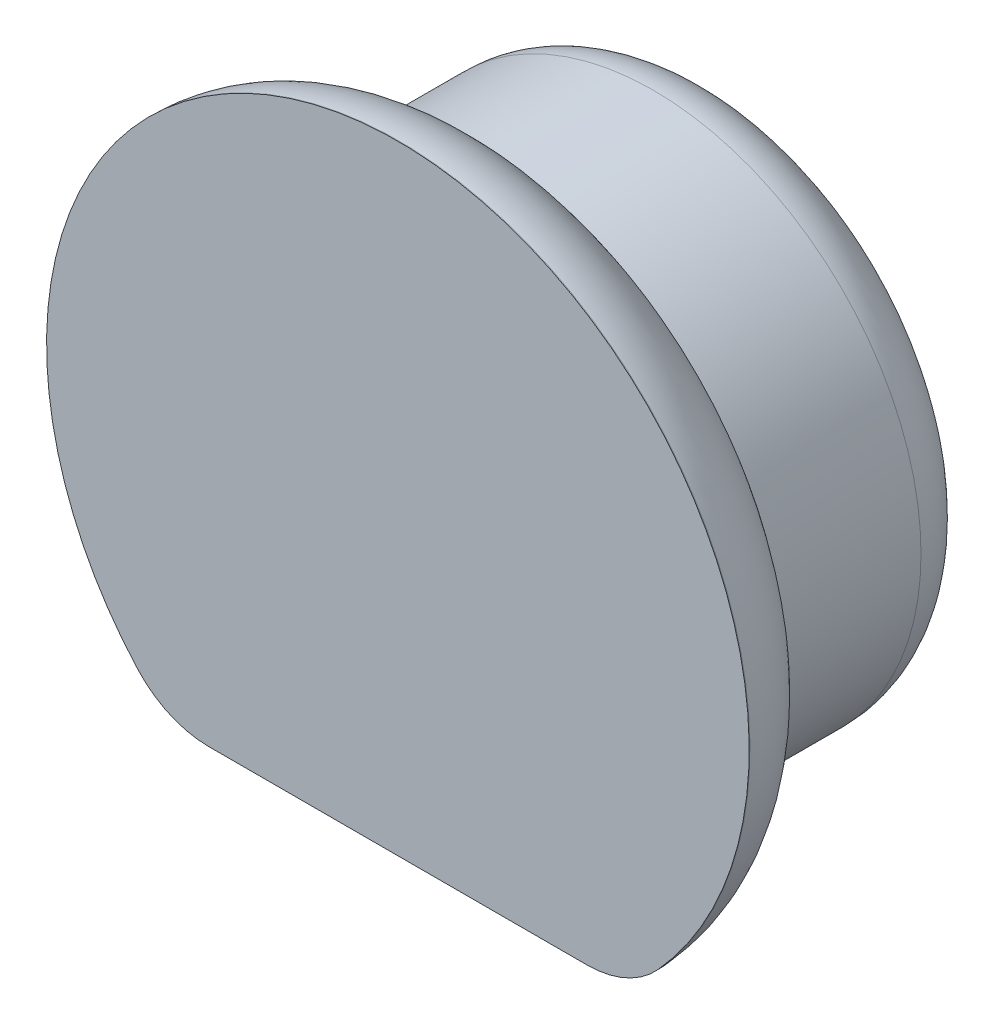
ISO-10303-21;
HEADER;
FILE_DESCRIPTION(('STEP AP214'),'2;1');
FILE_NAME('part.step','',(''),(''),'','','');
FILE_SCHEMA(('AUTOMOTIVE_DESIGN { 1 0 10303 214 1 1 1 1 }'));
ENDSEC;
DATA;
#1=APPLICATION_CONTEXT('core data for automotive mechanical design processes');
#2=APPLICATION_PROTOCOL_DEFINITION('international standard','automotive_design',2000,#1);
#3=PRODUCT_CONTEXT('',#1,'mechanical');
#4=PRODUCT('Part','Part','',(#3));
#5=PRODUCT_RELATED_PRODUCT_CATEGORY('part','',(#4));
#6=PRODUCT_DEFINITION_FORMATION('','',#4);
#7=PRODUCT_DEFINITION_CONTEXT('part definition',#1,'design');
#8=PRODUCT_DEFINITION('design','',#6,#7);
#9=PRODUCT_DEFINITION_SHAPE('','',#8);
#10=(LENGTH_UNIT() NAMED_UNIT(*) SI_UNIT(.MILLI.,.METRE.));
#11=(NAMED_UNIT(*) PLANE_ANGLE_UNIT() SI_UNIT($,.RADIAN.));
#12=(NAMED_UNIT(*) SI_UNIT($,.STERADIAN.) SOLID_ANGLE_UNIT());
#13=UNCERTAINTY_MEASURE_WITH_UNIT(LENGTH_MEASURE(1.E-05),#10,'distance_accuracy_value','');
#14=(GEOMETRIC_REPRESENTATION_CONTEXT(3) GLOBAL_UNCERTAINTY_ASSIGNED_CONTEXT((#13)) GLOBAL_UNIT_ASSIGNED_CONTEXT((#10,
#11,#12)) REPRESENTATION_CONTEXT('',''));
#15=CARTESIAN_POINT('',(0.,0.,0.));
#16=DIRECTION('',(0.,0.,1.));
#17=DIRECTION('',(1.,0.,0.));
#18=AXIS2_PLACEMENT_3D('',#15,#16,#17);
#19=CARTESIAN_POINT('',(0.,0.,5.));
#20=DIRECTION('',(0.,0.,-1.));
#21=DIRECTION('',(-1.,0.,0.));
#22=AXIS2_PLACEMENT_3D('',#19,#20,#21);
#23=CYLINDRICAL_SURFACE('',#22,5.5);
#24=CARTESIAN_POINT('',(0.,0.,4.98791800849375));
#25=DIRECTION('',(0.,0.,-1.));
#26=DIRECTION('',(-1.,0.,0.));
#27=AXIS2_PLACEMENT_3D('',#24,#25,#26);
#28=CIRCLE('',#27,5.5);
#29=CARTESIAN_POINT('',(4.07053417102719,-3.69875,4.98791800849375));
#30=VERTEX_POINT('',#29);
#31=CARTESIAN_POINT('',(-4.07053417102719,-3.69875,4.98791800849375));
#32=VERTEX_POINT('',#31);
#33=EDGE_CURVE('E218',#30,#32,#28,.F.);
#34=ORIENTED_EDGE('',*,*,#33,.T.);
#35=DIRECTION('',(0.,0.,-1.));
#36=VECTOR('',#35,1.);
#37=CARTESIAN_POINT('',(-4.07053417102719,-3.69875,5.));
#38=LINE('',#37,#36);
#39=CARTESIAN_POINT('',(-4.07053417102719,-3.69875,5.));
#40=VERTEX_POINT('',#39);
#41=EDGE_CURVE('E222',#32,#40,#38,.F.);
#42=ORIENTED_EDGE('',*,*,#41,.T.);
#43=CARTESIAN_POINT('',(0.,0.,5.));
#44=DIRECTION('',(0.,0.,1.));
#45=DIRECTION('',(1.,0.,0.));
#46=AXIS2_PLACEMENT_3D('',#43,#44,#45);
#47=CIRCLE('',#46,5.5);
#48=CARTESIAN_POINT('',(4.07053417102719,-3.69875,5.));
#49=VERTEX_POINT('',#48);
#50=EDGE_CURVE('E114',#49,#40,#47,.T.);
#51=ORIENTED_EDGE('',*,*,#50,.F.);
#52=DIRECTION('',(0.,0.,-1.));
#53=VECTOR('',#52,1.);
#54=CARTESIAN_POINT('',(4.07053417102719,-3.69875,5.));
#55=LINE('',#54,#53);
#56=EDGE_CURVE('E220',#49,#30,#55,.T.);
#57=ORIENTED_EDGE('',*,*,#56,.T.);
#58=EDGE_LOOP('',(#34,#42,#51,#57));
#59=FACE_BOUND('',#58,.T.);
#60=ADVANCED_FACE('F35',(#59),#23,.T.);
#61=CARTESIAN_POINT('',(0.,0.,5.));
#62=DIRECTION('',(0.,0.,1.));
#63=DIRECTION('',(1.,0.,0.));
#64=AXIS2_PLACEMENT_3D('',#61,#62,#63);
#65=PLANE('',#64);
#66=ORIENTED_EDGE('',*,*,#50,.T.);
#67=CARTESIAN_POINT('',(-2.96038848801977,-2.69,5.));
#68=DIRECTION('',(0.,0.,1.));
#69=DIRECTION('',(1.,0.,0.));
#70=AXIS2_PLACEMENT_3D('',#67,#68,#69);
#71=CIRCLE('',#70,1.5);
#72=CARTESIAN_POINT('',(-2.96038848801977,-4.19,5.));
#73=VERTEX_POINT('',#72);
#74=EDGE_CURVE('E118',#40,#73,#71,.T.);
#75=ORIENTED_EDGE('',*,*,#74,.T.);
#76=DIRECTION('',(1.,0.,0.));
#77=VECTOR('',#76,1.);
#78=CARTESIAN_POINT('',(0.,-4.19,5.));
#79=LINE('',#78,#77);
#80=CARTESIAN_POINT('',(2.96038848801977,-4.19,5.));
#81=VERTEX_POINT('',#80);
#82=EDGE_CURVE('E212',#73,#81,#79,.T.);
#83=ORIENTED_EDGE('',*,*,#82,.T.);
#84=CARTESIAN_POINT('',(2.96038848801977,-2.69,5.));
#85=DIRECTION('',(0.,0.,1.));
#86=DIRECTION('',(1.,0.,0.));
#87=AXIS2_PLACEMENT_3D('',#84,#85,#86);
#88=CIRCLE('',#87,1.5);
#89=EDGE_CURVE('E121',#81,#49,#88,.T.);
#90=ORIENTED_EDGE('',*,*,#89,.T.);
#91=EDGE_LOOP('',(#66,#75,#83,#90));
#92=FACE_BOUND('',#91,.T.);
#93=ADVANCED_FACE('F180',(#92),#65,.T.);
#94=CARTESIAN_POINT('',(0.,0.,3.5));
#95=DIRECTION('',(0.,0.,-1.));
#96=DIRECTION('',(-1.,0.,0.));
#97=AXIS2_PLACEMENT_3D('',#94,#95,#96);
#98=CYLINDRICAL_SURFACE('',#97,4.19);
#99=CARTESIAN_POINT('',(0.,0.,1.));
#100=DIRECTION('',(0.,0.,1.));
#101=DIRECTION('',(1.,0.,0.));
#102=AXIS2_PLACEMENT_3D('',#99,#100,#101);
#103=CIRCLE('',#102,4.19);
#104=CARTESIAN_POINT('',(4.19,0.,1.));
#105=VERTEX_POINT('',#104);
#106=EDGE_CURVE('E109',#105,#105,#103,.T.);
#107=ORIENTED_EDGE('',*,*,#106,.T.);
#108=EDGE_LOOP('',(#107));
#109=FACE_BOUND('',#108,.T.);
#110=CARTESIAN_POINT('',(0.,0.,3.5));
#111=DIRECTION('',(0.,0.,1.));
#112=DIRECTION('',(1.,0.,0.));
#113=AXIS2_PLACEMENT_3D('',#110,#111,#112);
#114=CIRCLE('',#113,4.19);
#115=CARTESIAN_POINT('',(0.,-4.19,3.5));
#116=VERTEX_POINT('',#115);
#117=CARTESIAN_POINT('',(3.10100694120071,-2.817775,3.5));
#118=VERTEX_POINT('',#117);
#119=EDGE_CURVE('E104',#116,#118,#114,.T.);
#120=ORIENTED_EDGE('',*,*,#119,.F.);
#121=CARTESIAN_POINT('',(-3.10100694120071,-2.817775,3.5));
#122=VERTEX_POINT('',#121);
#123=EDGE_CURVE('E55',#122,#116,#114,.T.);
#124=ORIENTED_EDGE('',*,*,#123,.F.);
#125=EDGE_CURVE('E106',#118,#122,#114,.T.);
#126=ORIENTED_EDGE('',*,*,#125,.F.);
#127=EDGE_LOOP('',(#120,#124,#126));
#128=FACE_BOUND('',#127,.T.);
#129=ADVANCED_FACE('F105',(#109,#128),#98,.T.);
#130=CARTESIAN_POINT('',(0.,0.,3.5));
#131=DIRECTION('',(0.,0.,-1.));
#132=DIRECTION('',(-1.,0.,0.));
#133=AXIS2_PLACEMENT_3D('',#130,#131,#132);
#134=CYLINDRICAL_SURFACE('',#133,3.19);
#135=CARTESIAN_POINT('',(0.,0.,0.));
#136=DIRECTION('',(0.,0.,1.));
#137=DIRECTION('',(1.,0.,0.));
#138=AXIS2_PLACEMENT_3D('',#135,#136,#137);
#139=CIRCLE('',#138,3.19);
#140=CARTESIAN_POINT('',(3.19,0.,0.));
#141=VERTEX_POINT('',#140);
#142=EDGE_CURVE('E205',#141,#141,#139,.T.);
#143=ORIENTED_EDGE('',*,*,#142,.F.);
#144=EDGE_LOOP('',(#143));
#145=FACE_BOUND('',#144,.T.);
#146=CARTESIAN_POINT('',(0.,0.,4.));
#147=DIRECTION('',(0.,0.,1.));
#148=DIRECTION('',(1.,0.,0.));
#149=AXIS2_PLACEMENT_3D('',#146,#147,#148);
#150=CIRCLE('',#149,3.19);
#151=CARTESIAN_POINT('',(3.19,0.,4.));
#152=VERTEX_POINT('',#151);
#153=EDGE_CURVE('E208',#152,#152,#150,.F.);
#154=ORIENTED_EDGE('',*,*,#153,.F.);
#155=EDGE_LOOP('',(#154));
#156=FACE_BOUND('',#155,.T.);
#157=ADVANCED_FACE('F193',(#145,#156),#134,.F.);
#158=CARTESIAN_POINT('',(0.,0.,4.));
#159=DIRECTION('',(0.,0.,1.));
#160=DIRECTION('',(1.,0.,0.));
#161=AXIS2_PLACEMENT_3D('',#158,#159,#160);
#162=PLANE('',#161);
#163=ORIENTED_EDGE('',*,*,#153,.T.);
#164=EDGE_LOOP('',(#163));
#165=FACE_BOUND('',#164,.T.);
#166=ADVANCED_FACE('F190',(#165),#162,.F.);
#167=CARTESIAN_POINT('',(0.,0.,1.));
#168=DIRECTION('',(0.,0.,1.));
#169=DIRECTION('',(1.,0.,0.));
#170=AXIS2_PLACEMENT_3D('',#167,#168,#169);
#171=TOROIDAL_SURFACE('',#170,3.19,1.);
#172=ORIENTED_EDGE('',*,*,#142,.T.);
#173=EDGE_LOOP('',(#172));
#174=FACE_BOUND('',#173,.T.);
#175=ORIENTED_EDGE('',*,*,#106,.F.);
#176=EDGE_LOOP('',(#175));
#177=FACE_BOUND('',#176,.T.);
#178=ADVANCED_FACE('F192',(#174,#177),#171,.T.);
#179=CARTESIAN_POINT('',(0.,-4.19,-0.00100000000000013));
#180=DIRECTION('',(0.,-1.,0.));
#181=DIRECTION('',(0.,0.,-1.));
#182=AXIS2_PLACEMENT_3D('',#179,#180,#181);
#183=PLANE('',#182);
#184=ORIENTED_EDGE('',*,*,#82,.F.);
#185=DIRECTION('',(0.,0.,1.));
#186=VECTOR('',#185,1.);
#187=CARTESIAN_POINT('',(-2.96038848801977,-4.19,4.98791800849375));
#188=LINE('',#187,#186);
#189=CARTESIAN_POINT('',(-2.96038848801977,-4.19,4.98791800849375));
#190=VERTEX_POINT('',#189);
#191=EDGE_CURVE('E97',#73,#190,#188,.F.);
#192=ORIENTED_EDGE('',*,*,#191,.T.);
#193=CARTESIAN_POINT('',(-3.24690063824087,-2.64834594518749,3.5));
#194=CARTESIAN_POINT('',(-3.24544199867491,-4.19,3.45719756913942));
#195=CARTESIAN_POINT('',(-3.29796892213496,-4.19,4.99855162410168));
#196=CARTESIAN_POINT('',(-3.21519535996072,-2.6872035769897,3.5));
#197=CARTESIAN_POINT('',(-3.21695801280037,-4.19,3.49770368237375));
#198=CARTESIAN_POINT('',(-3.21734918261013,-4.19,5.00129470085338));
#199=CARTESIAN_POINT('',(-3.18136945291794,-2.72726281848113,3.5));
#200=CARTESIAN_POINT('',(-3.18189602579683,-4.19,3.53699549712467));
#201=CARTESIAN_POINT('',(-3.13668740975386,-4.19,5.00009489427153));
#202=CARTESIAN_POINT('',(-3.10915387014983,-2.80931701585275,3.5));
#203=CARTESIAN_POINT('',(-3.10085587889862,-4.19,3.61039824755718));
#204=CARTESIAN_POINT('',(-2.97593381935426,-4.19,4.99052938868687));
#205=CARTESIAN_POINT('',(-3.07077300088984,-2.85130814339092,3.5));
#206=CARTESIAN_POINT('',(-3.05518840014636,-4.19,3.64463670982321));
#207=CARTESIAN_POINT('',(-2.89584120934479,-4.19,4.98217732937163));
#208=CARTESIAN_POINT('',(-2.94924716497314,-2.97853469550057,3.5));
#209=CARTESIAN_POINT('',(-2.90756575763336,-4.19,3.73602077793804));
#210=CARTESIAN_POINT('',(-2.65912042164179,-4.19,4.94777745164972));
#211=CARTESIAN_POINT('',(-2.85886918291593,-3.0661103845305,3.5));
#212=CARTESIAN_POINT('',(-2.79177719817343,-4.19,3.78612700317044));
#213=CARTESIAN_POINT('',(-2.50381246671036,-4.19,4.91241946534922));
#214=CARTESIAN_POINT('',(-2.67527140860843,-3.22660849065636,3.5));
#215=CARTESIAN_POINT('',(-2.55991415586229,-4.19,3.85237210776652));
#216=CARTESIAN_POINT('',(-2.2275669059051,-4.19,4.83037832074823));
#217=CARTESIAN_POINT('',(-2.58567382983506,-3.29924287415637,3.5));
#218=CARTESIAN_POINT('',(-2.44908272147964,-4.19,3.87362529013267));
#219=CARTESIAN_POINT('',(-2.10558829650335,-4.19,4.78700266085874));
#220=CARTESIAN_POINT('',(-2.39122243858085,-3.44278230522304,3.5));
#221=CARTESIAN_POINT('',(-2.21767821293484,-4.19,3.89928899956568));
#222=CARTESIAN_POINT('',(-1.86587446560169,-4.19,4.68968683688178));
#223=CARTESIAN_POINT('',(-2.28636036987726,-3.51368639252237,3.5));
#224=CARTESIAN_POINT('',(-2.09713209203962,-4.19,3.9042587451686));
#225=CARTESIAN_POINT('',(-1.7481415837953,-4.19,4.63574095009465));
#226=CARTESIAN_POINT('',(-2.06055152321316,-3.65072269933223,3.5));
#227=CARTESIAN_POINT('',(-1.84953092464674,-4.19,3.89951847637784));
#228=CARTESIAN_POINT('',(-1.51610327114738,-4.19,4.51918750987772));
#229=CARTESIAN_POINT('',(-1.9394997906174,-3.71681902417896,3.5));
#230=CARTESIAN_POINT('',(-1.72215536787907,-4.19,3.89011369495319));
#231=CARTESIAN_POINT('',(-1.40182673770269,-4.19,4.45652332039506));
#232=CARTESIAN_POINT('',(-1.68275765222374,-3.83987675037364,3.5));
#233=CARTESIAN_POINT('',(-1.46444245003879,-4.19,3.85928996357154));
#234=CARTESIAN_POINT('',(-1.17704445457249,-4.19,4.32486395953915));
#235=CARTESIAN_POINT('',(-1.54706952152017,-3.89683956802892,3.5));
#236=CARTESIAN_POINT('',(-1.33362388443764,-4.19,3.83808621970786));
#237=CARTESIAN_POINT('',(-1.06653812234864,-4.19,4.25586977235466));
#238=CARTESIAN_POINT('',(-1.29899243031584,-3.9851504665562,3.5));
#239=CARTESIAN_POINT('',(-1.10346120783475,-4.19,3.79312805546078));
#240=CARTESIAN_POINT('',(-0.876051461084383,-4.19,4.13133450686096));
#241=CARTESIAN_POINT('',(-1.18937048403474,-4.01933459633643,3.5));
#242=CARTESIAN_POINT('',(-1.00459067202388,-4.19,3.77146332808868));
#243=CARTESIAN_POINT('',(-0.795408275967917,-4.19,4.07679489801519));
#244=CARTESIAN_POINT('',(-0.964437118834433,-4.07915370758546,3.5));
#245=CARTESIAN_POINT('',(-0.806555015140356,-4.19,3.72444188936949));
#246=CARTESIAN_POINT('',(-0.635412448688602,-4.19,3.9658514058826));
#247=CARTESIAN_POINT('',(-0.849125390872721,-4.10478822409093,3.5));
#248=CARTESIAN_POINT('',(-0.707083628177916,-4.19,3.69904979170716));
#249=CARTESIAN_POINT('',(-0.556059876937809,-4.19,3.90944742138659));
#250=CARTESIAN_POINT('',(-0.614724969344387,-4.1463657676857,3.5));
#251=CARTESIAN_POINT('',(-0.50837162624085,-4.19,3.6458976915198));
#252=CARTESIAN_POINT('',(-0.398414485175102,-4.19,3.79554256806882));
#253=CARTESIAN_POINT('',(-0.495645049326916,-4.16232978194356,3.5));
#254=CARTESIAN_POINT('',(-0.408802290909814,-4.19,3.61807207723463));
#255=CARTESIAN_POINT('',(-0.32011973339475,-4.19,3.73804435592284));
#256=CARTESIAN_POINT('',(-0.255371464559821,-4.18394928095808,3.5));
#257=CARTESIAN_POINT('',(-0.209872784233015,-4.19,3.56125252265904));
#258=CARTESIAN_POINT('',(-0.163984478100119,-4.19,3.62243635619713));
#259=CARTESIAN_POINT('',(-0.134177788215034,-4.18960470914827,3.5));
#260=CARTESIAN_POINT('',(-0.110167566194327,-4.19,3.53216445906876));
#261=CARTESIAN_POINT('',(-0.0861439770807945,-4.19,3.56432656526324));
#262=CARTESIAN_POINT('',(-0.00863069666419835,-4.1899933587414,3.5));
#263=CARTESIAN_POINT('',(-0.00708582925471152,-4.19,3.50206882732741));
#264=CARTESIAN_POINT('',(-0.00554094694693522,-4.19,3.50413764733155));
#265=CARTESIAN_POINT('',(-0.00431534951348397,-4.19000002726726,3.5));
#266=CARTESIAN_POINT('',(-0.00354291100636918,-4.19,3.50103441322392));
#267=CARTESIAN_POINT('',(-0.00277047338136775,-4.19,3.50206882354184));
#268=CARTESIAN_POINT('',(-2.52290104827696E-13,-4.19,3.5));
#269=CARTESIAN_POINT('',(-2.52290104827696E-13,-4.19,3.5));
#270=CARTESIAN_POINT('',(0.,-4.19,3.5));
#271=(BOUNDED_SURFACE() B_SPLINE_SURFACE(3,2,((#193,#194,#195),(#196,#197,#198),(#199,#200,
#201),(#202,#203,#204),(#205,#206,#207),(#208,#209,#210),(#211,#212,#213),(#214,#215,#216),
(#217,#218,#219),(#220,#221,#222),(#223,#224,#225),(#226,#227,#228),(#229,#230,#231),(#232,#233,
#234),(#235,#236,#237),(#238,#239,#240),(#241,#242,#243),(#244,#245,#246),(#247,#248,#249),
(#250,#251,#252),(#253,#254,#255),(#256,#257,#258),(#259,#260,#261),(#262,#263,#264),(#265,#266,
#267),(#268,#269,#270)),.UNSPECIFIED.,.F.,.F.,.F.) B_SPLINE_SURFACE_WITH_KNOTS((4,2,2,2,2,2,2,2,
2,2,2,2,4),(3,3),(0.,0.241756617567825,0.483053217831717,0.959019822824176,1.34688942700301,
1.73496960613974,2.12570004900975,2.51636984368691,2.80840339145669,3.10045281862949,
3.3918661406066,3.68328106165559,3.69365410363952),(0.,1.),
.UNSPECIFIED.) GEOMETRIC_REPRESENTATION_ITEM() RATIONAL_B_SPLINE_SURFACE(((1.,0.69721970358166,
1.),(1.,0.706510244482818,1.),(1.,0.715898267757069,1.),(1.,0.734752123581949,1.),(1.,
0.74421777408504,1.),(1.,0.772349966704604,1.),(1.,0.791011831939329,1.),(1.,0.824070149076451,
1.),(1.,0.838616760505189,1.),(1.,0.866674060984754,1.),(1.,0.880184183344356,1.),(1.,
0.905762644675916,1.),(1.,0.91782050739231,1.),(1.,0.939901354512121,1.),(1.,0.949924654473709,
1.),(1.,0.965277209825123,1.),(1.,0.971152670860667,1.),(1.,0.981365071941367,1.),(1.,
0.985701928311657,1.),(1.,0.992707195145132,1.),(1.,0.995379219032506,1.),(1.,0.998992705977561,
1.),(1.,0.999934159539056,1.),(1.,0.999998891646025,1.),(1.,1.00000000295892,1.),(1.,1.,1.))) REPRESENTATION_ITEM('') SURFACE());
#272=CARTESIAN_POINT('',(-3.29796892213496,-4.19,4.99855162410168));
#273=CARTESIAN_POINT('',(-3.21734918261013,-4.19,5.00129470085338));
#274=CARTESIAN_POINT('',(-3.13668740975386,-4.19,5.00009489427153));
#275=CARTESIAN_POINT('',(-2.97593381935426,-4.19,4.99052938868687));
#276=CARTESIAN_POINT('',(-2.89584120934479,-4.19,4.98217732937163));
#277=CARTESIAN_POINT('',(-2.65912042164179,-4.19,4.94777745164972));
#278=CARTESIAN_POINT('',(-2.50381246671036,-4.19,4.91241946534922));
#279=CARTESIAN_POINT('',(-2.2275669059051,-4.19,4.83037832074823));
#280=CARTESIAN_POINT('',(-2.10558829650335,-4.19,4.78700266085874));
#281=CARTESIAN_POINT('',(-1.86587446560169,-4.19,4.68968683688178));
#282=CARTESIAN_POINT('',(-1.7481415837953,-4.19,4.63574095009465));
#283=CARTESIAN_POINT('',(-1.51610327114738,-4.19,4.51918750987772));
#284=CARTESIAN_POINT('',(-1.40182673770269,-4.19,4.45652332039506));
#285=CARTESIAN_POINT('',(-1.17704445457249,-4.19,4.32486395953915));
#286=CARTESIAN_POINT('',(-1.06653812234864,-4.19,4.25586977235466));
#287=CARTESIAN_POINT('',(-0.876051461084383,-4.19,4.13133450686096));
#288=CARTESIAN_POINT('',(-0.795408275967917,-4.19,4.07679489801519));
#289=CARTESIAN_POINT('',(-0.635412448688602,-4.19,3.9658514058826));
#290=CARTESIAN_POINT('',(-0.556059876937809,-4.19,3.90944742138659));
#291=CARTESIAN_POINT('',(-0.398414485175102,-4.19,3.79554256806882));
#292=CARTESIAN_POINT('',(-0.32011973339475,-4.19,3.73804435592284));
#293=CARTESIAN_POINT('',(-0.16398447810012,-4.19,3.62243635619713));
#294=CARTESIAN_POINT('',(-0.086143977080795,-4.19,3.56432656526324));
#295=CARTESIAN_POINT('',(-0.00554094694693522,-4.19,3.50413764733155));
#296=CARTESIAN_POINT('',(-0.00277047338136776,-4.19,3.50206882354184));
#297=CARTESIAN_POINT('',(0.,-4.19,3.5));
#298=B_SPLINE_CURVE_WITH_KNOTS('',3,(#272,#273,#274,#275,#276,#277,#278,#279,#280,#281,#282,
#283,#284,#285,#286,#287,#288,#289,#290,#291,#292,#293,#294,#295,#296,#297),.UNSPECIFIED.,.F.,
.F.,(4,2,2,2,2,2,2,2,2,2,2,2,4),(0.,0.241756617567825,0.483053217831717,0.959019822824176,
1.34688942700301,1.73496960613974,2.12570004900975,2.51636984368691,2.80840339145669,
3.10045281862949,3.3918661406066,3.68328106165559,3.69365410363952),.UNSPECIFIED.);
#299=EDGE_CURVE('E89',#190,#116,#298,.T.);
#300=ORIENTED_EDGE('',*,*,#299,.T.);
#301=CARTESIAN_POINT('',(3.29796892213494,-4.19,4.99855162410168));
#302=CARTESIAN_POINT('',(3.24544197201158,-4.19,3.457197604237));
#303=CARTESIAN_POINT('',(3.24690061115511,-2.64834597839493,3.5));
#304=CARTESIAN_POINT('',(3.21734918261385,-4.19,5.00129470085327));
#305=CARTESIAN_POINT('',(3.21695800323987,-4.19,3.4977036949453));
#306=CARTESIAN_POINT('',(3.21519534999819,-2.68720358920332,3.5));
#307=CARTESIAN_POINT('',(3.13668740976131,-4.19,5.00009489427166));
#308=CARTESIAN_POINT('',(3.18189602325959,-4.19,3.53699550046933));
#309=CARTESIAN_POINT('',(3.18136945019722,-2.72726282181666,3.5));
#310=CARTESIAN_POINT('',(2.97593381936895,-4.19,4.99052938868808));
#311=CARTESIAN_POINT('',(3.1008558812907,-4.19,3.61039824437264));
#312=CARTESIAN_POINT('',(3.1091538728769,-2.80931701251047,3.5));
#313=CARTESIAN_POINT('',(2.89584120936297,-4.19,4.98217732937368));
#314=CARTESIAN_POINT('',(3.05518840095456,-4.19,3.64463670874312));
#315=CARTESIAN_POINT('',(3.07077300184002,-2.85130814222786,3.5));
#316=CARTESIAN_POINT('',(2.65912042165603,-4.19,4.94777745165295));
#317=CARTESIAN_POINT('',(2.90756575623103,-4.19,3.73602077990831));
#318=CARTESIAN_POINT('',(2.94924716312347,-2.978534697769,3.5));
#319=CARTESIAN_POINT('',(2.50381246671731,-4.19,4.91241946535128));
#320=CARTESIAN_POINT('',(2.79177719785778,-4.19,3.7861270036288));
#321=CARTESIAN_POINT('',(2.85886918246241,-3.06611038508171,3.5));
#322=CARTESIAN_POINT('',(2.22756690590506,-4.19,4.83037832074822));
#323=CARTESIAN_POINT('',(2.55991415608166,-4.19,3.85237210741629));
#324=CARTESIAN_POINT('',(2.67527140897958,-3.2266084902058,3.5));
#325=CARTESIAN_POINT('',(2.10558829650331,-4.19,4.78700266085872));
#326=CARTESIAN_POINT('',(2.44908272154704,-4.19,3.8736252900402));
#327=CARTESIAN_POINT('',(2.58567382995245,-3.29924287402916,3.5));
#328=CARTESIAN_POINT('',(1.86587446560165,-4.19,4.68968683688177));
#329=CARTESIAN_POINT('',(2.21767821287775,-4.19,3.89928899965424));
#330=CARTESIAN_POINT('',(2.39122243846364,-3.44278230535015,3.5));
#331=CARTESIAN_POINT('',(1.74814158379526,-4.19,4.63574095009463));
#332=CARTESIAN_POINT('',(2.09713209197978,-4.19,3.90425874519506));
#333=CARTESIAN_POINT('',(2.28636036977936,-3.51368639258025,3.5));
#334=CARTESIAN_POINT('',(1.51610327114734,-4.19,4.5191875098777));
#335=CARTESIAN_POINT('',(1.8495309247016,-4.19,3.89951847635195));
#336=CARTESIAN_POINT('',(2.06055152331129,-3.65072269927423,3.5));
#337=CARTESIAN_POINT('',(1.40182673770265,-4.19,4.45652332039504));
#338=CARTESIAN_POINT('',(1.72215536805196,-4.19,3.89011369493507));
#339=CARTESIAN_POINT('',(1.93949979089331,-3.71681902407448,3.5));
#340=CARTESIAN_POINT('',(1.17704445457244,-4.19,4.32486395953912));
#341=CARTESIAN_POINT('',(1.4644424498767,-4.19,3.85928996358958));
#342=CARTESIAN_POINT('',(1.68275765195047,-3.83987675047686,3.5));
#343=CARTESIAN_POINT('',(1.06653812234859,-4.19,4.25586977235463));
#344=CARTESIAN_POINT('',(1.33362388384896,-4.19,3.83808621975595));
#345=CARTESIAN_POINT('',(1.54706952052007,-3.89683956838627,3.5));
#346=CARTESIAN_POINT('',(0.87605146108434,-4.19,4.13133450686093));
#347=CARTESIAN_POINT('',(1.10346120739342,-4.19,3.793128055498));
#348=CARTESIAN_POINT('',(1.29899242953625,-3.98515046683269,3.5));
#349=CARTESIAN_POINT('',(0.795408275967879,-4.19,4.07679489801517));
#350=CARTESIAN_POINT('',(1.00459067190772,-4.19,3.77146332809886));
#351=CARTESIAN_POINT('',(1.18937048382614,-4.01933459641048,3.5));
#352=CARTESIAN_POINT('',(0.635412448688573,-4.19,3.96585140588258));
#353=CARTESIAN_POINT('',(0.806555015252754,-4.19,3.72444188935877));
#354=CARTESIAN_POINT('',(0.964437119043167,-4.07915370751138,3.5));
#355=CARTESIAN_POINT('',(0.556059876937785,-4.19,3.90944742138658));
#356=CARTESIAN_POINT('',(0.70708362820735,-4.19,3.69904979170422));
#357=CARTESIAN_POINT('',(0.849125390927773,-4.10478822407118,3.5));
#358=CARTESIAN_POINT('',(0.398414485175087,-4.19,3.79554256806881));
#359=CARTESIAN_POINT('',(0.508371626212267,-4.19,3.64589769152288));
#360=CARTESIAN_POINT('',(0.614724969289289,-4.14636576770543,3.5));
#361=CARTESIAN_POINT('',(0.32011973339474,-4.19,3.73804435592282));
#362=CARTESIAN_POINT('',(0.408802290902709,-4.19,3.61807207723542));
#363=CARTESIAN_POINT('',(0.495645049314921,-4.16232978194858,3.5));
#364=CARTESIAN_POINT('',(0.163984478100113,-4.19,3.62243635619712));
#365=CARTESIAN_POINT('',(0.209872784239276,-4.19,3.5612525226582));
#366=CARTESIAN_POINT('',(0.25537146457055,-4.18394928095317,3.5));
#367=CARTESIAN_POINT('',(0.086143977080788,-4.19,3.56432656526324));
#368=CARTESIAN_POINT('',(0.11016756619328,-4.18999999999999,3.53216445906874));
#369=CARTESIAN_POINT('',(0.134177788205384,-4.18960470914813,3.5));
#370=CARTESIAN_POINT('',(0.00554094694693497,-4.19,3.50413764733155));
#371=CARTESIAN_POINT('',(0.00708582925437941,-4.19,3.50206882732741));
#372=CARTESIAN_POINT('',(0.00863069666380333,-4.18999335874141,3.5));
#373=CARTESIAN_POINT('',(0.00277047338136762,-4.19,3.50206882354184));
#374=CARTESIAN_POINT('',(0.00354291100607154,-4.19,3.50103441322392));
#375=CARTESIAN_POINT('',(0.00431534951344405,-4.19000002726727,3.5));
#376=CARTESIAN_POINT('',(0.,-4.19,3.5));
#377=CARTESIAN_POINT('',(0.,-4.19,3.5));
#378=CARTESIAN_POINT('',(6.07368905815859E-13,-4.19,3.5));
#379=(BOUNDED_SURFACE() B_SPLINE_SURFACE(3,2,((#301,#302,#303),(#304,#305,#306),(#307,#308,
#309),(#310,#311,#312),(#313,#314,#315),(#316,#317,#318),(#319,#320,#321),(#322,#323,#324),
(#325,#326,#327),(#328,#329,#330),(#331,#332,#333),(#334,#335,#336),(#337,#338,#339),(#340,#341,
#342),(#343,#344,#345),(#346,#347,#348),(#349,#350,#351),(#352,#353,#354),(#355,#356,#357),
(#358,#359,#360),(#361,#362,#363),(#364,#365,#366),(#367,#368,#369),(#370,#371,#372),(#373,#374,
#375),(#376,#377,#378)),.UNSPECIFIED.,.F.,.F.,.F.) B_SPLINE_SURFACE_WITH_KNOTS((4,2,2,2,2,2,2,2,
2,2,2,2,4),(3,3),(0.,0.241756617556638,0.483053217809888,0.959019822824146,1.346889427003,
1.73496960613973,2.12570004900974,2.51636984368691,2.80840339145667,3.10045281862945,
3.39186614060655,3.68328106165553,3.69365410363946),(0.,1.),
.UNSPECIFIED.) GEOMETRIC_REPRESENTATION_ITEM() RATIONAL_B_SPLINE_SURFACE(((1.,0.697219711519721,
1.),(1.,0.706510247402411,1.),(1.,0.715898268554431,1.),(1.,0.734752122783096,1.),(1.,
0.744217773807173,1.),(1.,0.772349967247013,1.),(1.,0.791011832071026,1.),(1.,0.824070148968847,
1.),(1.,0.838616760475224,1.),(1.,0.866674061014702,1.),(1.,0.880184183356528,1.),(1.,
0.90576264466371,1.),(1.,0.91782050737358,1.),(1.,0.939901354530625,1.),(1.,0.949924654535962,
1.),(1.,0.965277209873092,1.),(1.,0.971152670873513,1.),(1.,0.981365071928514,1.),(1.,
0.985701928308231,1.),(1.,0.992707195148555,1.),(1.,0.995379219033378,1.),(1.,0.998992705976708,
1.),(1.,0.99993415953903,1.),(1.,0.999998891646026,1.),(1.,1.00000000295892,1.),(1.,1.,1.))) REPRESENTATION_ITEM('') SURFACE());
#380=CARTESIAN_POINT('',(3.29796892213494,-4.19,4.99855162410168));
#381=CARTESIAN_POINT('',(3.21734918261385,-4.19,5.00129470085327));
#382=CARTESIAN_POINT('',(3.13668740976131,-4.19,5.00009489427166));
#383=CARTESIAN_POINT('',(2.97593381936895,-4.19,4.99052938868808));
#384=CARTESIAN_POINT('',(2.89584120936297,-4.19,4.98217732937369));
#385=CARTESIAN_POINT('',(2.65912042165603,-4.19,4.94777745165295));
#386=CARTESIAN_POINT('',(2.50381246671731,-4.19,4.91241946535128));
#387=CARTESIAN_POINT('',(2.22756690590506,-4.19,4.83037832074822));
#388=CARTESIAN_POINT('',(2.10558829650331,-4.19,4.78700266085872));
#389=CARTESIAN_POINT('',(1.86587446560165,-4.19,4.68968683688177));
#390=CARTESIAN_POINT('',(1.74814158379526,-4.19,4.63574095009463));
#391=CARTESIAN_POINT('',(1.51610327114734,-4.19,4.5191875098777));
#392=CARTESIAN_POINT('',(1.40182673770265,-4.19,4.45652332039504));
#393=CARTESIAN_POINT('',(1.17704445457244,-4.19,4.32486395953912));
#394=CARTESIAN_POINT('',(1.06653812234859,-4.19,4.25586977235463));
#395=CARTESIAN_POINT('',(0.87605146108434,-4.19,4.13133450686093));
#396=CARTESIAN_POINT('',(0.795408275967879,-4.19,4.07679489801517));
#397=CARTESIAN_POINT('',(0.635412448688573,-4.19,3.96585140588258));
#398=CARTESIAN_POINT('',(0.556059876937785,-4.19,3.90944742138658));
#399=CARTESIAN_POINT('',(0.398414485175087,-4.19,3.79554256806881));
#400=CARTESIAN_POINT('',(0.320119733394739,-4.19,3.73804435592282));
#401=CARTESIAN_POINT('',(0.163984478100113,-4.19,3.62243635619712));
#402=CARTESIAN_POINT('',(0.0861439770807886,-4.19,3.56432656526324));
#403=CARTESIAN_POINT('',(0.00554094694693497,-4.19,3.50413764733155));
#404=CARTESIAN_POINT('',(0.00277047338136763,-4.19,3.50206882354184));
#405=CARTESIAN_POINT('',(0.,-4.19,3.5));
#406=B_SPLINE_CURVE_WITH_KNOTS('',3,(#380,#381,#382,#383,#384,#385,#386,#387,#388,#389,#390,
#391,#392,#393,#394,#395,#396,#397,#398,#399,#400,#401,#402,#403,#404,#405),.UNSPECIFIED.,.F.,
.F.,(4,2,2,2,2,2,2,2,2,2,2,2,4),(0.,0.241756617556638,0.483053217809888,0.959019822824146,
1.346889427003,1.73496960613973,2.12570004900974,2.51636984368691,2.80840339145667,
3.10045281862945,3.39186614060655,3.68328106165553,3.69365410363946),.UNSPECIFIED.);
#407=CARTESIAN_POINT('',(2.96038848801977,-4.19,4.98791800849375));
#408=VERTEX_POINT('',#407);
#409=EDGE_CURVE('E94',#116,#408,#406,.F.);
#410=ORIENTED_EDGE('',*,*,#409,.T.);
#411=DIRECTION('',(0.,0.,1.));
#412=VECTOR('',#411,1.);
#413=CARTESIAN_POINT('',(2.96038848801977,-4.19,5.));
#414=LINE('',#413,#412);
#415=EDGE_CURVE('E101',#408,#81,#414,.T.);
#416=ORIENTED_EDGE('',*,*,#415,.T.);
#417=EDGE_LOOP('',(#184,#192,#300,#410,#416));
#418=FACE_BOUND('',#417,.T.);
#419=ADVANCED_FACE('F91',(#418),#183,.T.);
#420=CARTESIAN_POINT('',(0.,0.,4.98791800849375));
#421=DIRECTION('',(0.,0.,-1.));
#422=DIRECTION('',(-1.,0.,0.));
#423=AXIS2_PLACEMENT_3D('',#420,#421,#422);
#424=TOROIDAL_SURFACE('',#423,4.,1.5);
#425=ORIENTED_EDGE('',*,*,#125,.T.);
#426=CARTESIAN_POINT('',(-2.96038848801977,-2.69,4.98791800849375));
#427=DIRECTION('',(-0.6725,0.740097122004943,0.));
#428=DIRECTION('',(-0.740097122004943,-0.6725,0.));
#429=AXIS2_PLACEMENT_3D('',#426,#427,#428);
#430=CIRCLE('',#429,1.5);
#431=EDGE_CURVE('E11',#122,#32,#430,.T.);
#432=ORIENTED_EDGE('',*,*,#431,.T.);
#433=ORIENTED_EDGE('',*,*,#33,.F.);
#434=CARTESIAN_POINT('',(2.96038848801977,-2.69,4.98791800849375));
#435=DIRECTION('',(-0.6725,-0.740097122004943,0.));
#436=DIRECTION('',(0.740097122004943,-0.6725,0.));
#437=AXIS2_PLACEMENT_3D('',#434,#435,#436);
#438=CIRCLE('',#437,1.5);
#439=EDGE_CURVE('E47',#30,#118,#438,.F.);
#440=ORIENTED_EDGE('',*,*,#439,.T.);
#441=EDGE_LOOP('',(#425,#432,#433,#440));
#442=FACE_BOUND('',#441,.T.);
#443=ADVANCED_FACE('F135',(#442),#424,.T.);
#444=CARTESIAN_POINT('',(-2.96038848801977,-2.69,4.98791800849375));
#445=DIRECTION('',(-0.995563920835273,0.,0.0940876162473004));
#446=DIRECTION('',(0.0940876162473004,0.,0.995563920835273));
#447=AXIS2_PLACEMENT_3D('',#444,#445,#446);
#448=CIRCLE('',#447,1.5);
#449=EDGE_CURVE('E112',#122,#190,#448,.T.);
#450=ORIENTED_EDGE('',*,*,#449,.F.);
#451=ORIENTED_EDGE('',*,*,#123,.T.);
#452=ORIENTED_EDGE('',*,*,#299,.F.);
#453=EDGE_LOOP('',(#450,#451,#452));
#454=FACE_BOUND('',#453,.T.);
#455=ADVANCED_FACE('F111',(#454),#271,.T.);
#456=CARTESIAN_POINT('',(-2.96038848801977,-2.69,4.98791800849375));
#457=DIRECTION('',(0.,-1.,0.));
#458=DIRECTION('',(0.,0.,-1.));
#459=AXIS2_PLACEMENT_3D('',#456,#457,#458);
#460=SPHERICAL_SURFACE('',#459,1.5);
#461=ORIENTED_EDGE('',*,*,#431,.F.);
#462=ORIENTED_EDGE('',*,*,#449,.T.);
#463=CARTESIAN_POINT('',(-2.96038848801977,-2.69,4.98791800849375));
#464=DIRECTION('',(0.,0.,1.));
#465=DIRECTION('',(1.,0.,0.));
#466=AXIS2_PLACEMENT_3D('',#463,#464,#465);
#467=CIRCLE('',#466,1.5);
#468=EDGE_CURVE('E156',#32,#190,#467,.T.);
#469=ORIENTED_EDGE('',*,*,#468,.F.);
#470=EDGE_LOOP('',(#461,#462,#469));
#471=FACE_BOUND('',#470,.T.);
#472=ADVANCED_FACE('F235',(#471),#460,.T.);
#473=CARTESIAN_POINT('',(-2.96038848801977,-2.69,5.));
#474=DIRECTION('',(0.,0.,-1.));
#475=DIRECTION('',(-1.,0.,0.));
#476=AXIS2_PLACEMENT_3D('',#473,#474,#475);
#477=CYLINDRICAL_SURFACE('',#476,1.5);
#478=ORIENTED_EDGE('',*,*,#468,.T.);
#479=ORIENTED_EDGE('',*,*,#191,.F.);
#480=ORIENTED_EDGE('',*,*,#74,.F.);
#481=ORIENTED_EDGE('',*,*,#41,.F.);
#482=EDGE_LOOP('',(#478,#479,#480,#481));
#483=FACE_BOUND('',#482,.T.);
#484=ADVANCED_FACE('F146',(#483),#477,.T.);
#485=ORIENTED_EDGE('',*,*,#409,.F.);
#486=ORIENTED_EDGE('',*,*,#119,.T.);
#487=CARTESIAN_POINT('',(2.96038848801977,-2.69,4.98791800849375));
#488=DIRECTION('',(0.995563920835272,0.,0.0940876162473004));
#489=DIRECTION('',(0.0940876162473004,0.,-0.995563920835273));
#490=AXIS2_PLACEMENT_3D('',#487,#488,#489);
#491=CIRCLE('',#490,1.5);
#492=EDGE_CURVE('E116',#408,#118,#491,.T.);
#493=ORIENTED_EDGE('',*,*,#492,.F.);
#494=EDGE_LOOP('',(#485,#486,#493));
#495=FACE_BOUND('',#494,.T.);
#496=ADVANCED_FACE('F115',(#495),#379,.T.);
#497=CARTESIAN_POINT('',(2.96038848801977,-2.69,4.98791800849375));
#498=DIRECTION('',(0.,-1.,0.));
#499=DIRECTION('',(0.,0.,-1.));
#500=AXIS2_PLACEMENT_3D('',#497,#498,#499);
#501=SPHERICAL_SURFACE('',#500,1.5);
#502=ORIENTED_EDGE('',*,*,#492,.T.);
#503=ORIENTED_EDGE('',*,*,#439,.F.);
#504=CARTESIAN_POINT('',(2.96038848801977,-2.69,4.98791800849375));
#505=DIRECTION('',(0.,0.,1.));
#506=DIRECTION('',(1.,0.,0.));
#507=AXIS2_PLACEMENT_3D('',#504,#505,#506);
#508=CIRCLE('',#507,1.5);
#509=EDGE_CURVE('E157',#408,#30,#508,.T.);
#510=ORIENTED_EDGE('',*,*,#509,.F.);
#511=EDGE_LOOP('',(#502,#503,#510));
#512=FACE_BOUND('',#511,.T.);
#513=ADVANCED_FACE('F145',(#512),#501,.T.);
#514=CARTESIAN_POINT('',(2.96038848801977,-2.69,5.));
#515=DIRECTION('',(0.,0.,-1.));
#516=DIRECTION('',(-1.,0.,0.));
#517=AXIS2_PLACEMENT_3D('',#514,#515,#516);
#518=CYLINDRICAL_SURFACE('',#517,1.5);
#519=ORIENTED_EDGE('',*,*,#509,.T.);
#520=ORIENTED_EDGE('',*,*,#56,.F.);
#521=ORIENTED_EDGE('',*,*,#89,.F.);
#522=ORIENTED_EDGE('',*,*,#415,.F.);
#523=EDGE_LOOP('',(#519,#520,#521,#522));
#524=FACE_BOUND('',#523,.T.);
#525=ADVANCED_FACE('F172',(#524),#518,.T.);
#526=CLOSED_SHELL('',(#60,#93,#129,#157,#166,#178,#419,#443,#455,#472,#484,#496,#513,#525));
#527=MANIFOLD_SOLID_BREP('B2',#526);
#528=ADVANCED_BREP_SHAPE_REPRESENTATION('',(#18,#527),#14);
#529=SHAPE_DEFINITION_REPRESENTATION(#9,#528);
ENDSEC;
END-ISO-10303-21;
